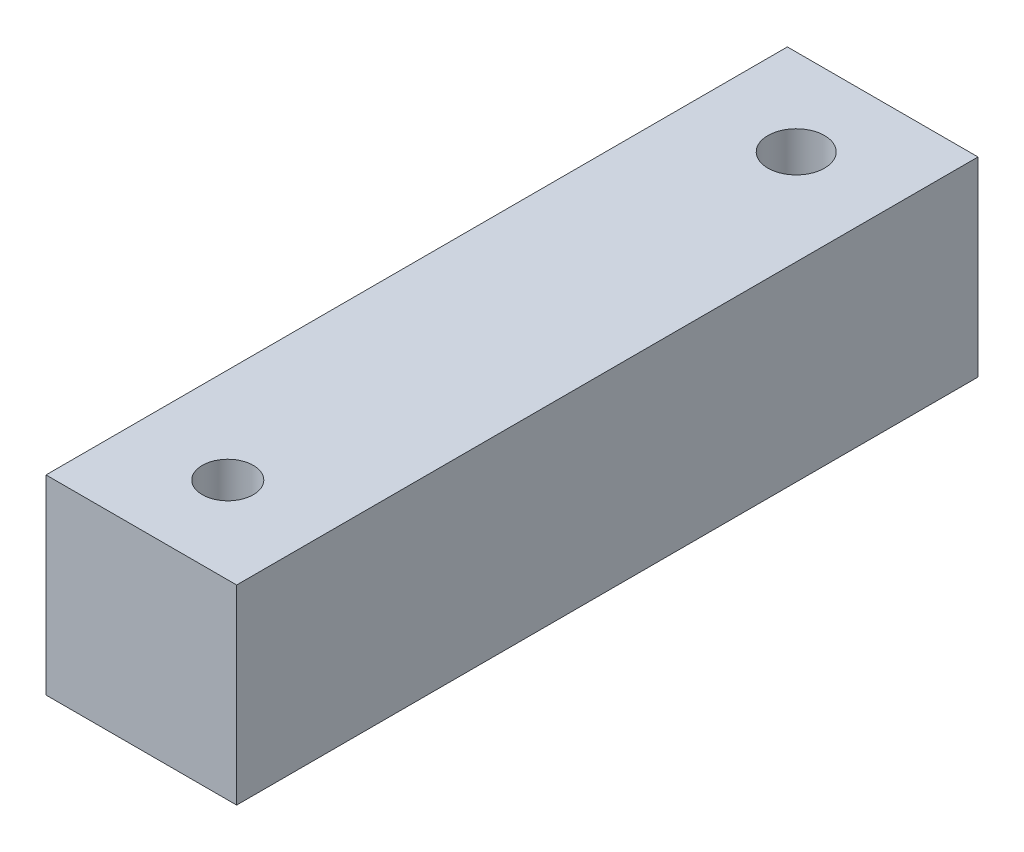
ISO-10303-21;
HEADER;
FILE_DESCRIPTION(('STEP AP214'),'2;1');
FILE_NAME('part.step','',(''),(''),'','','');
FILE_SCHEMA(('AUTOMOTIVE_DESIGN { 1 0 10303 214 1 1 1 1 }'));
ENDSEC;
DATA;
#1=APPLICATION_CONTEXT('core data for automotive mechanical design processes');
#2=APPLICATION_PROTOCOL_DEFINITION('international standard','automotive_design',2000,#1);
#3=PRODUCT_CONTEXT('',#1,'mechanical');
#4=PRODUCT('Part','Part','',(#3));
#5=PRODUCT_RELATED_PRODUCT_CATEGORY('part','',(#4));
#6=PRODUCT_DEFINITION_FORMATION('','',#4);
#7=PRODUCT_DEFINITION_CONTEXT('part definition',#1,'design');
#8=PRODUCT_DEFINITION('design','',#6,#7);
#9=PRODUCT_DEFINITION_SHAPE('','',#8);
#10=(LENGTH_UNIT() NAMED_UNIT(*) SI_UNIT(.MILLI.,.METRE.));
#11=(NAMED_UNIT(*) PLANE_ANGLE_UNIT() SI_UNIT($,.RADIAN.));
#12=(NAMED_UNIT(*) SI_UNIT($,.STERADIAN.) SOLID_ANGLE_UNIT());
#13=UNCERTAINTY_MEASURE_WITH_UNIT(LENGTH_MEASURE(1.E-05),#10,'distance_accuracy_value','');
#14=(GEOMETRIC_REPRESENTATION_CONTEXT(3) GLOBAL_UNCERTAINTY_ASSIGNED_CONTEXT((#13)) GLOBAL_UNIT_ASSIGNED_CONTEXT((#10,
#11,#12)) REPRESENTATION_CONTEXT('',''));
#15=CARTESIAN_POINT('',(0.,0.,0.));
#16=DIRECTION('',(0.,0.,1.));
#17=DIRECTION('',(1.,0.,0.));
#18=AXIS2_PLACEMENT_3D('',#15,#16,#17);
#19=CARTESIAN_POINT('',(0.,18.,70.));
#20=DIRECTION('',(1.,0.,0.));
#21=DIRECTION('',(0.,0.,-1.));
#22=AXIS2_PLACEMENT_3D('',#19,#20,#21);
#23=PLANE('',#22);
#24=DIRECTION('',(0.,-1.,0.));
#25=VECTOR('',#24,1.);
#26=CARTESIAN_POINT('',(0.,18.,0.));
#27=LINE('',#26,#25);
#28=CARTESIAN_POINT('',(0.,18.,0.));
#29=VERTEX_POINT('',#28);
#30=CARTESIAN_POINT('',(0.,0.,0.));
#31=VERTEX_POINT('',#30);
#32=EDGE_CURVE('E100',#29,#31,#27,.T.);
#33=ORIENTED_EDGE('',*,*,#32,.T.);
#34=DIRECTION('',(0.,0.,-1.));
#35=VECTOR('',#34,1.);
#36=CARTESIAN_POINT('',(0.,0.,70.));
#37=LINE('',#36,#35);
#38=CARTESIAN_POINT('',(0.,0.,70.));
#39=VERTEX_POINT('',#38);
#40=EDGE_CURVE('E11',#39,#31,#37,.T.);
#41=ORIENTED_EDGE('',*,*,#40,.F.);
#42=DIRECTION('',(0.,-1.,0.));
#43=VECTOR('',#42,1.);
#44=CARTESIAN_POINT('',(0.,18.,70.));
#45=LINE('',#44,#43);
#46=CARTESIAN_POINT('',(0.,18.,70.));
#47=VERTEX_POINT('',#46);
#48=EDGE_CURVE('E88',#47,#39,#45,.T.);
#49=ORIENTED_EDGE('',*,*,#48,.F.);
#50=DIRECTION('',(0.,0.,-1.));
#51=VECTOR('',#50,1.);
#52=CARTESIAN_POINT('',(0.,18.,70.));
#53=LINE('',#52,#51);
#54=EDGE_CURVE('E96',#47,#29,#53,.T.);
#55=ORIENTED_EDGE('',*,*,#54,.T.);
#56=EDGE_LOOP('',(#33,#41,#49,#55));
#57=FACE_BOUND('',#56,.T.);
#58=ADVANCED_FACE('F37',(#57),#23,.F.);
#59=CARTESIAN_POINT('',(0.,0.,70.));
#60=DIRECTION('',(0.,1.,0.));
#61=DIRECTION('',(0.,0.,1.));
#62=AXIS2_PLACEMENT_3D('',#59,#60,#61);
#63=PLANE('',#62);
#64=CARTESIAN_POINT('',(9.,0.,61.8359513733438));
#65=DIRECTION('',(0.,1.,0.));
#66=DIRECTION('',(0.,0.,1.));
#67=AXIS2_PLACEMENT_3D('',#64,#65,#66);
#68=CIRCLE('',#67,2.40714303645007);
#69=CARTESIAN_POINT('',(9.,0.,64.2430944097938));
#70=VERTEX_POINT('',#69);
#71=EDGE_CURVE('E103',#70,#70,#68,.T.);
#72=ORIENTED_EDGE('',*,*,#71,.T.);
#73=EDGE_LOOP('',(#72));
#74=FACE_BOUND('',#73,.T.);
#75=CARTESIAN_POINT('',(9.,0.,8.16404862665624));
#76=DIRECTION('',(0.,1.,0.));
#77=DIRECTION('',(0.,0.,1.));
#78=AXIS2_PLACEMENT_3D('',#75,#76,#77);
#79=CIRCLE('',#78,2.67294527917594);
#80=CARTESIAN_POINT('',(9.,0.,10.8369939058322));
#81=VERTEX_POINT('',#80);
#82=EDGE_CURVE('E116',#81,#81,#79,.T.);
#83=ORIENTED_EDGE('',*,*,#82,.T.);
#84=EDGE_LOOP('',(#83));
#85=FACE_BOUND('',#84,.T.);
#86=DIRECTION('',(1.,0.,0.));
#87=VECTOR('',#86,1.);
#88=CARTESIAN_POINT('',(0.,0.,0.));
#89=LINE('',#88,#87);
#90=CARTESIAN_POINT('',(18.,0.,0.));
#91=VERTEX_POINT('',#90);
#92=EDGE_CURVE('E92',#31,#91,#89,.T.);
#93=ORIENTED_EDGE('',*,*,#92,.T.);
#94=DIRECTION('',(0.,0.,-1.));
#95=VECTOR('',#94,1.);
#96=CARTESIAN_POINT('',(18.,0.,70.));
#97=LINE('',#96,#95);
#98=CARTESIAN_POINT('',(18.,0.,70.));
#99=VERTEX_POINT('',#98);
#100=EDGE_CURVE('E45',#99,#91,#97,.T.);
#101=ORIENTED_EDGE('',*,*,#100,.F.);
#102=DIRECTION('',(1.,0.,0.));
#103=VECTOR('',#102,1.);
#104=CARTESIAN_POINT('',(0.,0.,70.));
#105=LINE('',#104,#103);
#106=EDGE_CURVE('E83',#39,#99,#105,.T.);
#107=ORIENTED_EDGE('',*,*,#106,.F.);
#108=ORIENTED_EDGE('',*,*,#40,.T.);
#109=EDGE_LOOP('',(#93,#101,#107,#108));
#110=FACE_BOUND('',#109,.T.);
#111=ADVANCED_FACE('F91',(#74,#85,#110),#63,.F.);
#112=CARTESIAN_POINT('',(18.,18.,70.));
#113=DIRECTION('',(-1.,0.,0.));
#114=DIRECTION('',(0.,-1.,0.));
#115=AXIS2_PLACEMENT_3D('',#112,#113,#114);
#116=PLANE('',#115);
#117=DIRECTION('',(0.,1.,0.));
#118=VECTOR('',#117,1.);
#119=CARTESIAN_POINT('',(18.,18.,0.));
#120=LINE('',#119,#118);
#121=CARTESIAN_POINT('',(18.,18.,0.));
#122=VERTEX_POINT('',#121);
#123=EDGE_CURVE('E70',#91,#122,#120,.T.);
#124=ORIENTED_EDGE('',*,*,#123,.T.);
#125=DIRECTION('',(0.,0.,-1.));
#126=VECTOR('',#125,1.);
#127=CARTESIAN_POINT('',(18.,18.,70.));
#128=LINE('',#127,#126);
#129=CARTESIAN_POINT('',(18.,18.,70.));
#130=VERTEX_POINT('',#129);
#131=EDGE_CURVE('E93',#130,#122,#128,.T.);
#132=ORIENTED_EDGE('',*,*,#131,.F.);
#133=DIRECTION('',(0.,1.,0.));
#134=VECTOR('',#133,1.);
#135=CARTESIAN_POINT('',(18.,18.,70.));
#136=LINE('',#135,#134);
#137=EDGE_CURVE('E86',#99,#130,#136,.T.);
#138=ORIENTED_EDGE('',*,*,#137,.F.);
#139=ORIENTED_EDGE('',*,*,#100,.T.);
#140=EDGE_LOOP('',(#124,#132,#138,#139));
#141=FACE_BOUND('',#140,.T.);
#142=ADVANCED_FACE('F94',(#141),#116,.F.);
#143=CARTESIAN_POINT('',(0.,18.,70.));
#144=DIRECTION('',(0.,-1.,0.));
#145=DIRECTION('',(0.,0.,-1.));
#146=AXIS2_PLACEMENT_3D('',#143,#144,#145);
#147=PLANE('',#146);
#148=CARTESIAN_POINT('',(9.,18.,61.8359513733438));
#149=DIRECTION('',(0.,1.,0.));
#150=DIRECTION('',(0.,0.,1.));
#151=AXIS2_PLACEMENT_3D('',#148,#149,#150);
#152=CIRCLE('',#151,2.40714303645007);
#153=CARTESIAN_POINT('',(9.,18.,64.2430944097938));
#154=VERTEX_POINT('',#153);
#155=EDGE_CURVE('E119',#154,#154,#152,.T.);
#156=ORIENTED_EDGE('',*,*,#155,.F.);
#157=EDGE_LOOP('',(#156));
#158=FACE_BOUND('',#157,.T.);
#159=CARTESIAN_POINT('',(9.,18.,8.16404862665624));
#160=DIRECTION('',(0.,1.,0.));
#161=DIRECTION('',(0.,0.,1.));
#162=AXIS2_PLACEMENT_3D('',#159,#160,#161);
#163=CIRCLE('',#162,2.67294527917594);
#164=CARTESIAN_POINT('',(9.,18.,10.8369939058322));
#165=VERTEX_POINT('',#164);
#166=EDGE_CURVE('E120',#165,#165,#163,.T.);
#167=ORIENTED_EDGE('',*,*,#166,.F.);
#168=EDGE_LOOP('',(#167));
#169=FACE_BOUND('',#168,.T.);
#170=DIRECTION('',(-1.,0.,0.));
#171=VECTOR('',#170,1.);
#172=CARTESIAN_POINT('',(0.,18.,0.));
#173=LINE('',#172,#171);
#174=EDGE_CURVE('E76',#122,#29,#173,.T.);
#175=ORIENTED_EDGE('',*,*,#174,.T.);
#176=ORIENTED_EDGE('',*,*,#54,.F.);
#177=DIRECTION('',(-1.,0.,0.));
#178=VECTOR('',#177,1.);
#179=CARTESIAN_POINT('',(0.,18.,70.));
#180=LINE('',#179,#178);
#181=EDGE_CURVE('E53',#130,#47,#180,.T.);
#182=ORIENTED_EDGE('',*,*,#181,.F.);
#183=ORIENTED_EDGE('',*,*,#131,.T.);
#184=EDGE_LOOP('',(#175,#176,#182,#183));
#185=FACE_BOUND('',#184,.T.);
#186=ADVANCED_FACE('F108',(#158,#169,#185),#147,.F.);
#187=CARTESIAN_POINT('',(0.,0.,70.));
#188=DIRECTION('',(0.,0.,1.));
#189=DIRECTION('',(1.,0.,0.));
#190=AXIS2_PLACEMENT_3D('',#187,#188,#189);
#191=PLANE('',#190);
#192=ORIENTED_EDGE('',*,*,#48,.T.);
#193=ORIENTED_EDGE('',*,*,#106,.T.);
#194=ORIENTED_EDGE('',*,*,#137,.T.);
#195=ORIENTED_EDGE('',*,*,#181,.T.);
#196=EDGE_LOOP('',(#192,#193,#194,#195));
#197=FACE_BOUND('',#196,.T.);
#198=ADVANCED_FACE('F84',(#197),#191,.T.);
#199=CARTESIAN_POINT('',(0.,0.,0.));
#200=DIRECTION('',(0.,0.,1.));
#201=DIRECTION('',(1.,0.,0.));
#202=AXIS2_PLACEMENT_3D('',#199,#200,#201);
#203=PLANE('',#202);
#204=ORIENTED_EDGE('',*,*,#32,.F.);
#205=ORIENTED_EDGE('',*,*,#174,.F.);
#206=ORIENTED_EDGE('',*,*,#123,.F.);
#207=ORIENTED_EDGE('',*,*,#92,.F.);
#208=EDGE_LOOP('',(#204,#205,#206,#207));
#209=FACE_BOUND('',#208,.T.);
#210=ADVANCED_FACE('F111',(#209),#203,.F.);
#211=CARTESIAN_POINT('',(9.,-32.,8.16404862665624));
#212=DIRECTION('',(0.,1.,0.));
#213=DIRECTION('',(0.,0.,1.));
#214=AXIS2_PLACEMENT_3D('',#211,#212,#213);
#215=CYLINDRICAL_SURFACE('',#214,2.67294527917594);
#216=ORIENTED_EDGE('',*,*,#166,.T.);
#217=EDGE_LOOP('',(#216));
#218=FACE_BOUND('',#217,.T.);
#219=ORIENTED_EDGE('',*,*,#82,.F.);
#220=EDGE_LOOP('',(#219));
#221=FACE_BOUND('',#220,.T.);
#222=ADVANCED_FACE('F134',(#218,#221),#215,.F.);
#223=CARTESIAN_POINT('',(9.,-32.,61.8359513733438));
#224=DIRECTION('',(0.,1.,0.));
#225=DIRECTION('',(0.,0.,1.));
#226=AXIS2_PLACEMENT_3D('',#223,#224,#225);
#227=CYLINDRICAL_SURFACE('',#226,2.40714303645007);
#228=ORIENTED_EDGE('',*,*,#155,.T.);
#229=EDGE_LOOP('',(#228));
#230=FACE_BOUND('',#229,.T.);
#231=ORIENTED_EDGE('',*,*,#71,.F.);
#232=EDGE_LOOP('',(#231));
#233=FACE_BOUND('',#232,.T.);
#234=ADVANCED_FACE('F126',(#230,#233),#227,.F.);
#235=CLOSED_SHELL('',(#58,#111,#142,#186,#198,#210,#222,#234));
#236=MANIFOLD_SOLID_BREP('B2',#235);
#237=ADVANCED_BREP_SHAPE_REPRESENTATION('',(#18,#236),#14);
#238=SHAPE_DEFINITION_REPRESENTATION(#9,#237);
ENDSEC;
END-ISO-10303-21;
